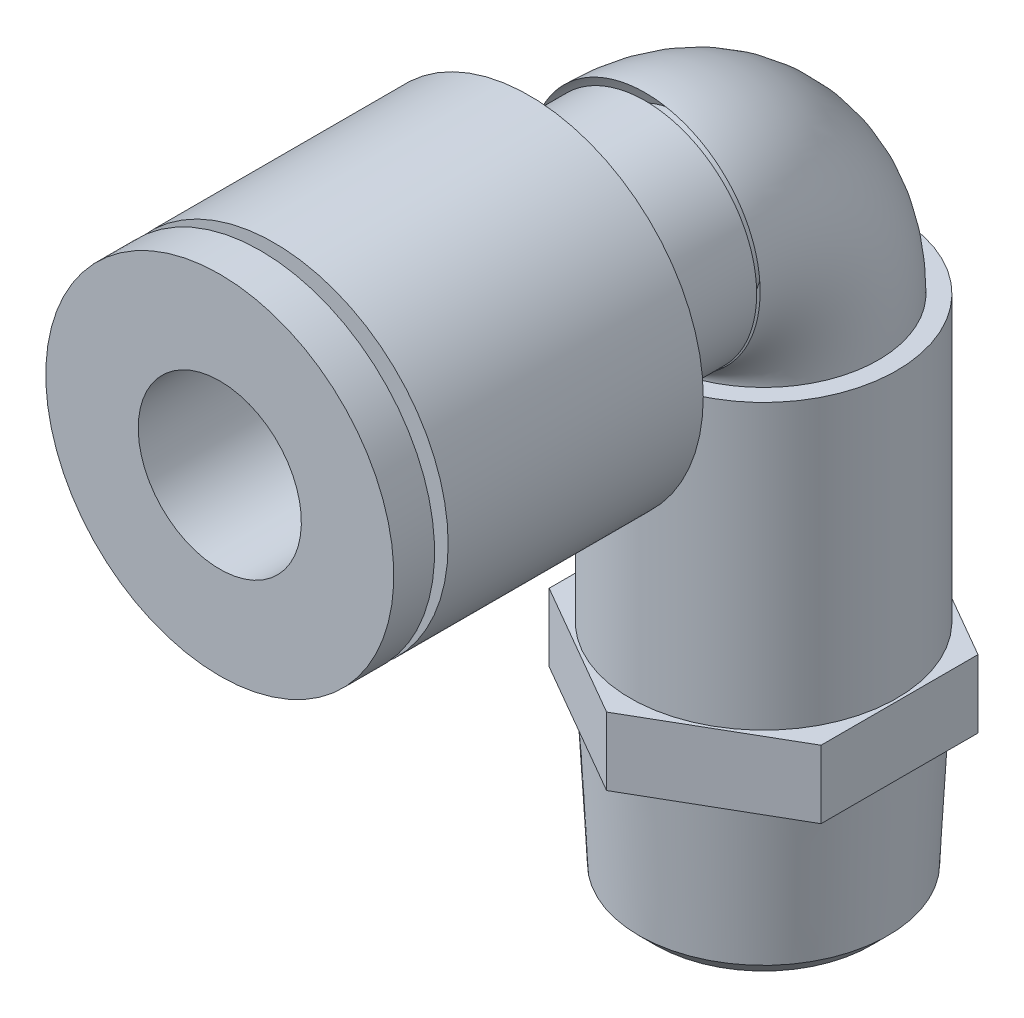
ISO-10303-21;
HEADER;
FILE_DESCRIPTION(('STEP AP214'),'2;1');
FILE_NAME('part.step','',(''),(''),'','','');
FILE_SCHEMA(('AUTOMOTIVE_DESIGN { 1 0 10303 214 1 1 1 1 }'));
ENDSEC;
DATA;
#1=APPLICATION_CONTEXT('core data for automotive mechanical design processes');
#2=APPLICATION_PROTOCOL_DEFINITION('international standard','automotive_design',2000,#1);
#3=PRODUCT_CONTEXT('',#1,'mechanical');
#4=PRODUCT('Part','Part','',(#3));
#5=PRODUCT_RELATED_PRODUCT_CATEGORY('part','',(#4));
#6=PRODUCT_DEFINITION_FORMATION('','',#4);
#7=PRODUCT_DEFINITION_CONTEXT('part definition',#1,'design');
#8=PRODUCT_DEFINITION('design','',#6,#7);
#9=PRODUCT_DEFINITION_SHAPE('','',#8);
#10=(LENGTH_UNIT() NAMED_UNIT(*) SI_UNIT(.MILLI.,.METRE.));
#11=(NAMED_UNIT(*) PLANE_ANGLE_UNIT() SI_UNIT($,.RADIAN.));
#12=(NAMED_UNIT(*) SI_UNIT($,.STERADIAN.) SOLID_ANGLE_UNIT());
#13=UNCERTAINTY_MEASURE_WITH_UNIT(LENGTH_MEASURE(1.E-05),#10,'distance_accuracy_value','');
#14=(GEOMETRIC_REPRESENTATION_CONTEXT(3) GLOBAL_UNCERTAINTY_ASSIGNED_CONTEXT((#13)) GLOBAL_UNIT_ASSIGNED_CONTEXT((#10,
#11,#12)) REPRESENTATION_CONTEXT('',''));
#15=CARTESIAN_POINT('',(0.,0.,0.));
#16=DIRECTION('',(0.,0.,1.));
#17=DIRECTION('',(1.,0.,0.));
#18=AXIS2_PLACEMENT_3D('',#15,#16,#17);
#19=CARTESIAN_POINT('',(-3.,19.9639957961841,3.));
#20=DIRECTION('',(0.,0.,1.));
#21=DIRECTION('',(1.,0.,0.));
#22=AXIS2_PLACEMENT_3D('',#19,#20,#21);
#23=PLANE('',#22);
#24=CARTESIAN_POINT('',(0.,23.,3.));
#25=DIRECTION('',(0.,0.,-1.));
#26=DIRECTION('',(0.,1.,0.));
#27=AXIS2_PLACEMENT_3D('',#24,#25,#26);
#28=CIRCLE('',#27,3.);
#29=CARTESIAN_POINT('',(0.,26.,3.));
#30=VERTEX_POINT('',#29);
#31=EDGE_CURVE('E19',#30,#30,#28,.T.);
#32=ORIENTED_EDGE('',*,*,#31,.F.);
#33=EDGE_LOOP('',(#32));
#34=FACE_BOUND('',#33,.T.);
#35=ADVANCED_FACE('F16',(#34),#23,.T.);
#36=CARTESIAN_POINT('',(0.,23.,20.));
#37=DIRECTION('',(0.,0.,-1.));
#38=DIRECTION('',(0.,1.,0.));
#39=AXIS2_PLACEMENT_3D('',#36,#37,#38);
#40=CYLINDRICAL_SURFACE('',#39,3.);
#41=ORIENTED_EDGE('',*,*,#31,.T.);
#42=EDGE_LOOP('',(#41));
#43=FACE_BOUND('',#42,.T.);
#44=CARTESIAN_POINT('',(0.,23.,20.));
#45=DIRECTION('',(0.,0.,-1.));
#46=DIRECTION('',(0.,1.,0.));
#47=AXIS2_PLACEMENT_3D('',#44,#45,#46);
#48=CIRCLE('',#47,3.);
#49=CARTESIAN_POINT('',(0.,26.,20.));
#50=VERTEX_POINT('',#49);
#51=EDGE_CURVE('E285',#50,#50,#48,.T.);
#52=ORIENTED_EDGE('',*,*,#51,.F.);
#53=EDGE_LOOP('',(#52));
#54=FACE_BOUND('',#53,.T.);
#55=ADVANCED_FACE('F272',(#43,#54),#40,.F.);
#56=CARTESIAN_POINT('',(6.4,29.4768021082254,20.));
#57=DIRECTION('',(0.,0.,1.));
#58=DIRECTION('',(-1.,0.,0.));
#59=AXIS2_PLACEMENT_3D('',#56,#57,#58);
#60=PLANE('',#59);
#61=ORIENTED_EDGE('',*,*,#51,.T.);
#62=EDGE_LOOP('',(#61));
#63=FACE_BOUND('',#62,.T.);
#64=CARTESIAN_POINT('',(0.,23.,20.));
#65=DIRECTION('',(0.,0.,1.));
#66=DIRECTION('',(0.,-1.,0.));
#67=AXIS2_PLACEMENT_3D('',#64,#65,#66);
#68=CIRCLE('',#67,6.4);
#69=CARTESIAN_POINT('',(0.,16.6,20.));
#70=VERTEX_POINT('',#69);
#71=EDGE_CURVE('E286',#70,#70,#68,.F.);
#72=ORIENTED_EDGE('',*,*,#71,.F.);
#73=EDGE_LOOP('',(#72));
#74=FACE_BOUND('',#73,.T.);
#75=ADVANCED_FACE('F269',(#63,#74),#60,.T.);
#76=CARTESIAN_POINT('',(0.,23.,20.));
#77=DIRECTION('',(0.,0.,1.));
#78=DIRECTION('',(0.,-1.,0.));
#79=AXIS2_PLACEMENT_3D('',#76,#77,#78);
#80=CYLINDRICAL_SURFACE('',#79,6.4);
#81=ORIENTED_EDGE('',*,*,#71,.T.);
#82=EDGE_LOOP('',(#81));
#83=FACE_BOUND('',#82,.T.);
#84=CARTESIAN_POINT('',(0.,23.,18.5));
#85=DIRECTION('',(0.,0.,1.));
#86=DIRECTION('',(0.,-1.,0.));
#87=AXIS2_PLACEMENT_3D('',#84,#85,#86);
#88=CIRCLE('',#87,6.4);
#89=CARTESIAN_POINT('',(0.,16.6,18.5));
#90=VERTEX_POINT('',#89);
#91=EDGE_CURVE('E288',#90,#90,#88,.F.);
#92=ORIENTED_EDGE('',*,*,#91,.F.);
#93=EDGE_LOOP('',(#92));
#94=FACE_BOUND('',#93,.T.);
#95=ADVANCED_FACE('F265',(#83,#94),#80,.T.);
#96=CARTESIAN_POINT('',(3.96101064172926,0.,4.00854487762027));
#97=DIRECTION('',(0.,-1.,0.));
#98=DIRECTION('',(-1.,0.,0.));
#99=AXIS2_PLACEMENT_3D('',#96,#97,#98);
#100=PLANE('',#99);
#101=CARTESIAN_POINT('',(0.,0.,0.));
#102=DIRECTION('',(0.,1.,0.));
#103=DIRECTION('',(0.,0.,1.));
#104=AXIS2_PLACEMENT_3D('',#101,#102,#103);
#105=CIRCLE('',#104,3.96101064172926);
#106=CARTESIAN_POINT('',(0.,0.,3.96101064172926));
#107=VERTEX_POINT('',#106);
#108=EDGE_CURVE('E293',#107,#107,#105,.T.);
#109=ORIENTED_EDGE('',*,*,#108,.F.);
#110=EDGE_LOOP('',(#109));
#111=FACE_BOUND('',#110,.T.);
#112=ADVANCED_FACE('F261',(#111),#100,.T.);
#113=CARTESIAN_POINT('',(-6.40000000000001,29.4768021082673,18.5));
#114=DIRECTION('',(0.,0.,-1.));
#115=DIRECTION('',(1.,0.,0.));
#116=AXIS2_PLACEMENT_3D('',#113,#114,#115);
#117=PLANE('',#116);
#118=CARTESIAN_POINT('',(0.,23.,18.5));
#119=DIRECTION('',(0.,0.,1.));
#120=DIRECTION('',(0.,-1.,0.));
#121=AXIS2_PLACEMENT_3D('',#118,#119,#120);
#122=CIRCLE('',#121,4.5);
#123=CARTESIAN_POINT('',(0.,18.5,18.5));
#124=VERTEX_POINT('',#123);
#125=EDGE_CURVE('E109',#124,#124,#122,.F.);
#126=ORIENTED_EDGE('',*,*,#125,.F.);
#127=EDGE_LOOP('',(#126));
#128=FACE_BOUND('',#127,.T.);
#129=ORIENTED_EDGE('',*,*,#91,.T.);
#130=EDGE_LOOP('',(#129));
#131=FACE_BOUND('',#130,.T.);
#132=ADVANCED_FACE('F257',(#128,#131),#117,.T.);
#133=CARTESIAN_POINT('',(0.,0.,0.));
#134=DIRECTION('',(0.,1.,0.));
#135=DIRECTION('',(0.,0.,1.));
#136=AXIS2_PLACEMENT_3D('',#133,#134,#135);
#137=CONICAL_SURFACE('',#136,3.96101064172926,0.78539816339745);
#138=CARTESIAN_POINT('',(0.,0.62034509794002,0.));
#139=DIRECTION('',(0.,-1.,0.));
#140=DIRECTION('',(-1.,0.,0.));
#141=AXIS2_PLACEMENT_3D('',#138,#139,#140);
#142=CIRCLE('',#141,4.58135573966928);
#143=CARTESIAN_POINT('',(-4.58135573966928,0.62034509794002,0.));
#144=VERTEX_POINT('',#143);
#145=EDGE_CURVE('E106',#144,#144,#142,.F.);
#146=ORIENTED_EDGE('',*,*,#145,.F.);
#147=EDGE_LOOP('',(#146));
#148=FACE_BOUND('',#147,.T.);
#149=ORIENTED_EDGE('',*,*,#108,.T.);
#150=EDGE_LOOP('',(#149));
#151=FACE_BOUND('',#150,.T.);
#152=ADVANCED_FACE('F253',(#148,#151),#137,.T.);
#153=CARTESIAN_POINT('',(0.,23.,18.5));
#154=DIRECTION('',(0.,0.,1.));
#155=DIRECTION('',(0.,-1.,0.));
#156=AXIS2_PLACEMENT_3D('',#153,#154,#155);
#157=CYLINDRICAL_SURFACE('',#156,4.5);
#158=ORIENTED_EDGE('',*,*,#125,.T.);
#159=EDGE_LOOP('',(#158));
#160=FACE_BOUND('',#159,.T.);
#161=CARTESIAN_POINT('',(0.,23.,18.));
#162=DIRECTION('',(0.,0.,1.));
#163=DIRECTION('',(0.,-1.,0.));
#164=AXIS2_PLACEMENT_3D('',#161,#162,#163);
#165=CIRCLE('',#164,4.5);
#166=CARTESIAN_POINT('',(0.,18.5,18.));
#167=VERTEX_POINT('',#166);
#168=EDGE_CURVE('E108',#167,#167,#165,.F.);
#169=ORIENTED_EDGE('',*,*,#168,.F.);
#170=EDGE_LOOP('',(#169));
#171=FACE_BOUND('',#170,.T.);
#172=ADVANCED_FACE('F249',(#160,#171),#157,.T.);
#173=CARTESIAN_POINT('',(0.,0.62034509794002,0.));
#174=DIRECTION('',(0.,1.,0.));
#175=DIRECTION('',(0.,0.,1.));
#176=AXIS2_PLACEMENT_3D('',#173,#174,#175);
#177=CONICAL_SURFACE('',#176,4.58135573966928,0.0523598775598302);
#178=CARTESIAN_POINT('',(0.,5.838,0.));
#179=DIRECTION('',(0.,1.,0.));
#180=DIRECTION('',(0.,0.,1.));
#181=AXIS2_PLACEMENT_3D('',#178,#179,#180);
#182=CIRCLE('',#181,4.85480144615152);
#183=CARTESIAN_POINT('',(0.,5.838,4.85480144615152));
#184=VERTEX_POINT('',#183);
#185=EDGE_CURVE('E300',#184,#184,#182,.T.);
#186=ORIENTED_EDGE('',*,*,#185,.F.);
#187=EDGE_LOOP('',(#186));
#188=FACE_BOUND('',#187,.T.);
#189=ORIENTED_EDGE('',*,*,#145,.T.);
#190=EDGE_LOOP('',(#189));
#191=FACE_BOUND('',#190,.T.);
#192=ADVANCED_FACE('F245',(#188,#191),#177,.T.);
#193=CARTESIAN_POINT('',(6.39999999999999,29.4768021082255,18.));
#194=DIRECTION('',(0.,0.,1.));
#195=DIRECTION('',(-1.,0.,0.));
#196=AXIS2_PLACEMENT_3D('',#193,#194,#195);
#197=PLANE('',#196);
#198=ORIENTED_EDGE('',*,*,#168,.T.);
#199=EDGE_LOOP('',(#198));
#200=FACE_BOUND('',#199,.T.);
#201=CARTESIAN_POINT('',(0.,23.,18.));
#202=DIRECTION('',(0.,0.,1.));
#203=DIRECTION('',(1.,0.,0.));
#204=AXIS2_PLACEMENT_3D('',#201,#202,#203);
#205=CIRCLE('',#204,6.4);
#206=CARTESIAN_POINT('',(6.4,23.,18.));
#207=VERTEX_POINT('',#206);
#208=EDGE_CURVE('E84',#207,#207,#205,.F.);
#209=ORIENTED_EDGE('',*,*,#208,.F.);
#210=EDGE_LOOP('',(#209));
#211=FACE_BOUND('',#210,.T.);
#212=ADVANCED_FACE('F241',(#200,#211),#197,.T.);
#213=CARTESIAN_POINT('',(-5.,5.838,5.77350269189626));
#214=DIRECTION('',(0.,-1.,0.));
#215=DIRECTION('',(0.,0.,-1.));
#216=AXIS2_PLACEMENT_3D('',#213,#214,#215);
#217=PLANE('',#216);
#218=ORIENTED_EDGE('',*,*,#185,.T.);
#219=EDGE_LOOP('',(#218));
#220=FACE_BOUND('',#219,.T.);
#221=DIRECTION('',(0.866025403784438,0.,-0.5));
#222=VECTOR('',#221,1.);
#223=CARTESIAN_POINT('',(2.5,5.838,4.3301270189222));
#224=LINE('',#223,#222);
#225=CARTESIAN_POINT('',(6.25124987581674E-08,5.838,5.77350265580465));
#226=VERTEX_POINT('',#225);
#227=CARTESIAN_POINT('',(5.,5.838,2.88675134594813));
#228=VERTEX_POINT('',#227);
#229=EDGE_CURVE('E204',#226,#228,#224,.T.);
#230=ORIENTED_EDGE('',*,*,#229,.F.);
#231=DIRECTION('',(0.866025403784438,0.,0.5));
#232=VECTOR('',#231,1.);
#233=CARTESIAN_POINT('',(-2.5,5.838,4.3301270189222));
#234=LINE('',#233,#232);
#235=CARTESIAN_POINT('',(-5.,5.838,2.88675134594813));
#236=VERTEX_POINT('',#235);
#237=EDGE_CURVE('E90',#236,#226,#234,.T.);
#238=ORIENTED_EDGE('',*,*,#237,.F.);
#239=DIRECTION('',(0.,0.,1.));
#240=VECTOR('',#239,1.);
#241=CARTESIAN_POINT('',(-5.,5.838,0.));
#242=LINE('',#241,#240);
#243=CARTESIAN_POINT('',(-5.,5.838,-2.88675134594813));
#244=VERTEX_POINT('',#243);
#245=EDGE_CURVE('E87',#244,#236,#242,.T.);
#246=ORIENTED_EDGE('',*,*,#245,.F.);
#247=DIRECTION('',(-0.866025403784438,0.,0.5));
#248=VECTOR('',#247,1.);
#249=CARTESIAN_POINT('',(-2.5,5.838,-4.3301270189222));
#250=LINE('',#249,#248);
#251=CARTESIAN_POINT('',(-1.25024997787385E-07,5.838,-5.77350261971304));
#252=VERTEX_POINT('',#251);
#253=EDGE_CURVE('E73',#252,#244,#250,.T.);
#254=ORIENTED_EDGE('',*,*,#253,.F.);
#255=DIRECTION('',(-0.866025403784438,0.,-0.5));
#256=VECTOR('',#255,1.);
#257=CARTESIAN_POINT('',(2.5,5.838,-4.3301270189222));
#258=LINE('',#257,#256);
#259=CARTESIAN_POINT('',(5.,5.838,-2.88675134594813));
#260=VERTEX_POINT('',#259);
#261=EDGE_CURVE('E196',#260,#252,#258,.T.);
#262=ORIENTED_EDGE('',*,*,#261,.F.);
#263=DIRECTION('',(0.,0.,-1.));
#264=VECTOR('',#263,1.);
#265=CARTESIAN_POINT('',(5.,5.838,0.));
#266=LINE('',#265,#264);
#267=EDGE_CURVE('E199',#228,#260,#266,.T.);
#268=ORIENTED_EDGE('',*,*,#267,.F.);
#269=EDGE_LOOP('',(#230,#238,#246,#254,#262,#268));
#270=FACE_BOUND('',#269,.T.);
#271=ADVANCED_FACE('F89',(#220,#270),#217,.T.);
#272=CARTESIAN_POINT('',(0.,23.,18.));
#273=DIRECTION('',(0.,0.,1.));
#274=DIRECTION('',(1.,0.,0.));
#275=AXIS2_PLACEMENT_3D('',#272,#273,#274);
#276=CYLINDRICAL_SURFACE('',#275,6.4);
#277=CARTESIAN_POINT('',(0.,23.,8.6173549393613));
#278=DIRECTION('',(0.,0.,-1.));
#279=DIRECTION('',(-1.,0.,0.));
#280=AXIS2_PLACEMENT_3D('',#277,#278,#279);
#281=CIRCLE('',#280,6.39999999999999);
#282=CARTESIAN_POINT('',(-6.39999999999999,23.,8.6173549393613));
#283=VERTEX_POINT('',#282);
#284=EDGE_CURVE('E102',#283,#283,#281,.T.);
#285=ORIENTED_EDGE('',*,*,#284,.F.);
#286=EDGE_LOOP('',(#285));
#287=FACE_BOUND('',#286,.T.);
#288=ORIENTED_EDGE('',*,*,#208,.T.);
#289=EDGE_LOOP('',(#288));
#290=FACE_BOUND('',#289,.T.);
#291=ADVANCED_FACE('F235',(#287,#290),#276,.T.);
#292=CARTESIAN_POINT('',(0.,5.838,-5.77350269189626));
#293=DIRECTION('',(-0.5,0.,-0.866025403784438));
#294=DIRECTION('',(-0.866025403784438,0.,0.5));
#295=AXIS2_PLACEMENT_3D('',#292,#293,#294);
#296=PLANE('',#295);
#297=ORIENTED_EDGE('',*,*,#253,.T.);
#298=DIRECTION('',(0.,1.,0.));
#299=VECTOR('',#298,1.);
#300=CARTESIAN_POINT('',(-5.,5.838,-2.88675134594813));
#301=LINE('',#300,#299);
#302=CARTESIAN_POINT('',(-5.,8.338,-2.88675134594813));
#303=VERTEX_POINT('',#302);
#304=EDGE_CURVE('E77',#303,#244,#301,.F.);
#305=ORIENTED_EDGE('',*,*,#304,.F.);
#306=CARTESIAN_POINT('',(0.,8.338,-5.77350269189626));
#307=CARTESIAN_POINT('',(-0.208333333333334,8.338,-5.65322138581509));
#308=CARTESIAN_POINT('',(-0.416666666666667,8.338,-5.53294007973392));
#309=CARTESIAN_POINT('',(-0.833333333333333,8.338,-5.29237746757157));
#310=CARTESIAN_POINT('',(-1.04166666666667,8.338,-5.1720961614904));
#311=CARTESIAN_POINT('',(-1.45833333333333,8.338,-4.93153354932806));
#312=CARTESIAN_POINT('',(-1.66666666666667,8.338,-4.81125224324688));
#313=CARTESIAN_POINT('',(-2.08333333333333,8.338,-4.57068963108454));
#314=CARTESIAN_POINT('',(-2.29166666666667,8.338,-4.45040832500337));
#315=CARTESIAN_POINT('',(-2.70833333333333,8.338,-4.20984571284102));
#316=CARTESIAN_POINT('',(-2.91666666666667,8.338,-4.08956440675985));
#317=CARTESIAN_POINT('',(-3.33333333333333,8.338,-3.84900179459751));
#318=CARTESIAN_POINT('',(-3.54166666666667,8.338,-3.72872048851633));
#319=CARTESIAN_POINT('',(-3.95833333333333,8.338,-3.48815787635399));
#320=CARTESIAN_POINT('',(-4.16666666666667,8.338,-3.36787657027282));
#321=CARTESIAN_POINT('',(-4.58333333333333,8.338,-3.12731395811047));
#322=CARTESIAN_POINT('',(-4.79166666666667,8.338,-3.0070326520293));
#323=CARTESIAN_POINT('',(-5.,8.338,-2.88675134594813));
#324=B_SPLINE_CURVE_WITH_KNOTS('',3,(#306,#307,#308,#309,#310,#311,#312,#313,#314,#315,#316,
#317,#318,#319,#320,#321,#322,#323),.UNSPECIFIED.,.F.,.F.,(4,2,2,2,2,2,2,2,4),(0.,
0.721687836487032,1.44337567297406,2.1650635094611,2.88675134594813,3.60843918243516,
4.33012701892219,5.05181485540923,5.77350269189626),.UNSPECIFIED.);
#325=CARTESIAN_POINT('',(-6.25124988123775E-08,8.338,-5.77350265580465));
#326=VERTEX_POINT('',#325);
#327=EDGE_CURVE('E105',#326,#303,#324,.T.);
#328=ORIENTED_EDGE('',*,*,#327,.F.);
#329=DIRECTION('',(0.,1.,0.));
#330=VECTOR('',#329,1.);
#331=CARTESIAN_POINT('',(0.,5.838,-5.77350269189626));
#332=LINE('',#331,#330);
#333=EDGE_CURVE('E80',#252,#326,#332,.T.);
#334=ORIENTED_EDGE('',*,*,#333,.F.);
#335=EDGE_LOOP('',(#297,#305,#328,#334));
#336=FACE_BOUND('',#335,.T.);
#337=ADVANCED_FACE('F75',(#336),#296,.T.);
#338=CARTESIAN_POINT('',(-5.,5.838,-2.88675134594813));
#339=DIRECTION('',(-1.,0.,0.));
#340=DIRECTION('',(0.,0.,1.));
#341=AXIS2_PLACEMENT_3D('',#338,#339,#340);
#342=PLANE('',#341);
#343=ORIENTED_EDGE('',*,*,#245,.T.);
#344=DIRECTION('',(0.,1.,0.));
#345=VECTOR('',#344,1.);
#346=CARTESIAN_POINT('',(-5.,5.838,2.88675134594813));
#347=LINE('',#346,#345);
#348=CARTESIAN_POINT('',(-5.,8.338,2.88675134594813));
#349=VERTEX_POINT('',#348);
#350=EDGE_CURVE('E93',#349,#236,#347,.F.);
#351=ORIENTED_EDGE('',*,*,#350,.F.);
#352=DIRECTION('',(0.,0.,1.));
#353=VECTOR('',#352,1.);
#354=CARTESIAN_POINT('',(-5.,8.338,0.));
#355=LINE('',#354,#353);
#356=EDGE_CURVE('E97',#303,#349,#355,.T.);
#357=ORIENTED_EDGE('',*,*,#356,.F.);
#358=ORIENTED_EDGE('',*,*,#304,.T.);
#359=EDGE_LOOP('',(#343,#351,#357,#358));
#360=FACE_BOUND('',#359,.T.);
#361=ADVANCED_FACE('F95',(#360),#342,.T.);
#362=CARTESIAN_POINT('',(-5.,5.838,2.88675134594813));
#363=DIRECTION('',(-0.5,0.,0.866025403784438));
#364=DIRECTION('',(0.866025403784438,0.,0.5));
#365=AXIS2_PLACEMENT_3D('',#362,#363,#364);
#366=PLANE('',#365);
#367=ORIENTED_EDGE('',*,*,#237,.T.);
#368=DIRECTION('',(0.,1.,0.));
#369=VECTOR('',#368,1.);
#370=CARTESIAN_POINT('',(0.,5.838,5.77350269189626));
#371=LINE('',#370,#369);
#372=CARTESIAN_POINT('',(-6.25124988123775E-08,8.338,5.77350265580465));
#373=VERTEX_POINT('',#372);
#374=EDGE_CURVE('E206',#373,#226,#371,.F.);
#375=ORIENTED_EDGE('',*,*,#374,.F.);
#376=CARTESIAN_POINT('',(-5.,8.338,2.88675134594813));
#377=CARTESIAN_POINT('',(-4.79166666666667,8.338,3.0070326520293));
#378=CARTESIAN_POINT('',(-4.58333333333333,8.338,3.12731395811047));
#379=CARTESIAN_POINT('',(-4.16666666666667,8.338,3.36787657027282));
#380=CARTESIAN_POINT('',(-3.95833333333333,8.338,3.48815787635399));
#381=CARTESIAN_POINT('',(-3.54166666666667,8.338,3.72872048851633));
#382=CARTESIAN_POINT('',(-3.33333333333333,8.338,3.84900179459751));
#383=CARTESIAN_POINT('',(-2.91666666666667,8.338,4.08956440675985));
#384=CARTESIAN_POINT('',(-2.70833333333333,8.338,4.20984571284102));
#385=CARTESIAN_POINT('',(-2.29166666666667,8.338,4.45040832500337));
#386=CARTESIAN_POINT('',(-2.08333333333333,8.338,4.57068963108454));
#387=CARTESIAN_POINT('',(-1.66666666666667,8.338,4.81125224324688));
#388=CARTESIAN_POINT('',(-1.45833333333333,8.338,4.93153354932806));
#389=CARTESIAN_POINT('',(-1.04166666666667,8.338,5.1720961614904));
#390=CARTESIAN_POINT('',(-0.833333333333333,8.338,5.29237746757157));
#391=CARTESIAN_POINT('',(-0.416666666666667,8.338,5.53294007973392));
#392=CARTESIAN_POINT('',(-0.208333333333333,8.338,5.65322138581509));
#393=CARTESIAN_POINT('',(0.,8.338,5.77350269189626));
#394=B_SPLINE_CURVE_WITH_KNOTS('',3,(#376,#377,#378,#379,#380,#381,#382,#383,#384,#385,#386,
#387,#388,#389,#390,#391,#392,#393),.UNSPECIFIED.,.F.,.F.,(4,2,2,2,2,2,2,2,4),(0.,
0.721687836487032,1.44337567297406,2.1650635094611,2.88675134594813,3.60843918243516,
4.33012701892219,5.05181485540923,5.77350269189626),.UNSPECIFIED.);
#395=EDGE_CURVE('E157',#349,#373,#394,.T.);
#396=ORIENTED_EDGE('',*,*,#395,.F.);
#397=ORIENTED_EDGE('',*,*,#350,.T.);
#398=EDGE_LOOP('',(#367,#375,#396,#397));
#399=FACE_BOUND('',#398,.T.);
#400=ADVANCED_FACE('F211',(#399),#366,.T.);
#401=CARTESIAN_POINT('',(0.,5.838,5.77350269189626));
#402=DIRECTION('',(0.5,0.,0.866025403784438));
#403=DIRECTION('',(0.866025403784438,0.,-0.5));
#404=AXIS2_PLACEMENT_3D('',#401,#402,#403);
#405=PLANE('',#404);
#406=ORIENTED_EDGE('',*,*,#229,.T.);
#407=DIRECTION('',(0.,1.,0.));
#408=VECTOR('',#407,1.);
#409=CARTESIAN_POINT('',(5.,5.838,2.88675134594813));
#410=LINE('',#409,#408);
#411=CARTESIAN_POINT('',(5.,8.338,2.88675134594813));
#412=VERTEX_POINT('',#411);
#413=EDGE_CURVE('E201',#412,#228,#410,.F.);
#414=ORIENTED_EDGE('',*,*,#413,.F.);
#415=CARTESIAN_POINT('',(0.,8.338,5.77350269189626));
#416=CARTESIAN_POINT('',(0.208333333333334,8.338,5.65322138581509));
#417=CARTESIAN_POINT('',(0.416666666666667,8.338,5.53294007973392));
#418=CARTESIAN_POINT('',(0.833333333333334,8.338,5.29237746757157));
#419=CARTESIAN_POINT('',(1.04166666666667,8.338,5.1720961614904));
#420=CARTESIAN_POINT('',(1.45833333333333,8.338,4.93153354932805));
#421=CARTESIAN_POINT('',(1.66666666666667,8.338,4.81125224324688));
#422=CARTESIAN_POINT('',(2.08333333333333,8.338,4.57068963108454));
#423=CARTESIAN_POINT('',(2.29166666666667,8.338,4.45040832500337));
#424=CARTESIAN_POINT('',(2.70833333333333,8.338,4.20984571284102));
#425=CARTESIAN_POINT('',(2.91666666666667,8.338,4.08956440675985));
#426=CARTESIAN_POINT('',(3.33333333333333,8.338,3.84900179459751));
#427=CARTESIAN_POINT('',(3.54166666666667,8.338,3.72872048851633));
#428=CARTESIAN_POINT('',(3.95833333333333,8.338,3.48815787635399));
#429=CARTESIAN_POINT('',(4.16666666666667,8.338,3.36787657027282));
#430=CARTESIAN_POINT('',(4.58333333333333,8.338,3.12731395811047));
#431=CARTESIAN_POINT('',(4.79166666666667,8.338,3.0070326520293));
#432=CARTESIAN_POINT('',(5.,8.338,2.88675134594813));
#433=B_SPLINE_CURVE_WITH_KNOTS('',3,(#415,#416,#417,#418,#419,#420,#421,#422,#423,#424,#425,
#426,#427,#428,#429,#430,#431,#432),.UNSPECIFIED.,.F.,.F.,(4,2,2,2,2,2,2,2,4),(0.,
0.721687836487032,1.44337567297406,2.1650635094611,2.88675134594813,3.60843918243516,
4.33012701892219,5.05181485540923,5.77350269189626),.UNSPECIFIED.);
#434=EDGE_CURVE('E164',#373,#412,#433,.T.);
#435=ORIENTED_EDGE('',*,*,#434,.F.);
#436=ORIENTED_EDGE('',*,*,#374,.T.);
#437=EDGE_LOOP('',(#406,#414,#435,#436));
#438=FACE_BOUND('',#437,.T.);
#439=ADVANCED_FACE('F219',(#438),#405,.T.);
#440=CARTESIAN_POINT('',(5.,5.838,2.88675134594813));
#441=DIRECTION('',(1.,0.,0.));
#442=DIRECTION('',(0.,0.,-1.));
#443=AXIS2_PLACEMENT_3D('',#440,#441,#442);
#444=PLANE('',#443);
#445=ORIENTED_EDGE('',*,*,#267,.T.);
#446=DIRECTION('',(0.,1.,0.));
#447=VECTOR('',#446,1.);
#448=CARTESIAN_POINT('',(5.,5.838,-2.88675134594813));
#449=LINE('',#448,#447);
#450=CARTESIAN_POINT('',(5.,8.338,-2.88675134594813));
#451=VERTEX_POINT('',#450);
#452=EDGE_CURVE('E39',#451,#260,#449,.F.);
#453=ORIENTED_EDGE('',*,*,#452,.F.);
#454=DIRECTION('',(0.,0.,-1.));
#455=VECTOR('',#454,1.);
#456=CARTESIAN_POINT('',(5.,8.338,0.));
#457=LINE('',#456,#455);
#458=EDGE_CURVE('E173',#412,#451,#457,.T.);
#459=ORIENTED_EDGE('',*,*,#458,.F.);
#460=ORIENTED_EDGE('',*,*,#413,.T.);
#461=EDGE_LOOP('',(#445,#453,#459,#460));
#462=FACE_BOUND('',#461,.T.);
#463=ADVANCED_FACE('F217',(#462),#444,.T.);
#464=CARTESIAN_POINT('',(5.,5.838,-2.88675134594813));
#465=DIRECTION('',(0.5,0.,-0.866025403784438));
#466=DIRECTION('',(-0.866025403784438,0.,-0.5));
#467=AXIS2_PLACEMENT_3D('',#464,#465,#466);
#468=PLANE('',#467);
#469=ORIENTED_EDGE('',*,*,#261,.T.);
#470=ORIENTED_EDGE('',*,*,#333,.T.);
#471=CARTESIAN_POINT('',(5.,8.338,-2.88675134594813));
#472=CARTESIAN_POINT('',(4.79166666666667,8.338,-3.0070326520293));
#473=CARTESIAN_POINT('',(4.58333333333333,8.338,-3.12731395811047));
#474=CARTESIAN_POINT('',(4.16666666666667,8.338,-3.36787657027282));
#475=CARTESIAN_POINT('',(3.95833333333333,8.338,-3.48815787635399));
#476=CARTESIAN_POINT('',(3.54166666666667,8.338,-3.72872048851633));
#477=CARTESIAN_POINT('',(3.33333333333333,8.338,-3.84900179459751));
#478=CARTESIAN_POINT('',(2.91666666666667,8.338,-4.08956440675985));
#479=CARTESIAN_POINT('',(2.70833333333333,8.338,-4.20984571284102));
#480=CARTESIAN_POINT('',(2.29166666666667,8.338,-4.45040832500337));
#481=CARTESIAN_POINT('',(2.08333333333333,8.338,-4.57068963108454));
#482=CARTESIAN_POINT('',(1.66666666666667,8.338,-4.81125224324688));
#483=CARTESIAN_POINT('',(1.45833333333333,8.338,-4.93153354932805));
#484=CARTESIAN_POINT('',(1.04166666666667,8.338,-5.1720961614904));
#485=CARTESIAN_POINT('',(0.833333333333334,8.338,-5.29237746757157));
#486=CARTESIAN_POINT('',(0.416666666666667,8.338,-5.53294007973392));
#487=CARTESIAN_POINT('',(0.208333333333334,8.338,-5.65322138581509));
#488=CARTESIAN_POINT('',(0.,8.338,-5.77350269189626));
#489=B_SPLINE_CURVE_WITH_KNOTS('',3,(#471,#472,#473,#474,#475,#476,#477,#478,#479,#480,#481,
#482,#483,#484,#485,#486,#487,#488),.UNSPECIFIED.,.F.,.F.,(4,2,2,2,2,2,2,2,4),(0.,
0.721687836487032,1.44337567297407,2.1650635094611,2.88675134594813,3.60843918243516,
4.33012701892219,5.05181485540923,5.77350269189626),.UNSPECIFIED.);
#490=EDGE_CURVE('E174',#451,#326,#489,.T.);
#491=ORIENTED_EDGE('',*,*,#490,.F.);
#492=ORIENTED_EDGE('',*,*,#452,.T.);
#493=EDGE_LOOP('',(#469,#470,#491,#492));
#494=FACE_BOUND('',#493,.T.);
#495=ADVANCED_FACE('F215',(#494),#468,.T.);
#496=CARTESIAN_POINT('',(0.,23.,8.));
#497=DIRECTION('',(0.,0.,1.));
#498=DIRECTION('',(1.,0.,0.));
#499=AXIS2_PLACEMENT_3D('',#496,#497,#498);
#500=CONICAL_SURFACE('',#499,4.096,1.30899693899575);
#501=CARTESIAN_POINT('',(0.,23.,8.));
#502=DIRECTION('',(0.,0.,1.));
#503=DIRECTION('',(-1.,0.,0.));
#504=AXIS2_PLACEMENT_3D('',#501,#502,#503);
#505=CIRCLE('',#504,4.096);
#506=CARTESIAN_POINT('',(-4.096,23.,8.));
#507=VERTEX_POINT('',#506);
#508=EDGE_CURVE('E183',#507,#507,#505,.F.);
#509=ORIENTED_EDGE('',*,*,#508,.F.);
#510=EDGE_LOOP('',(#509));
#511=FACE_BOUND('',#510,.T.);
#512=ORIENTED_EDGE('',*,*,#284,.T.);
#513=EDGE_LOOP('',(#512));
#514=FACE_BOUND('',#513,.T.);
#515=ADVANCED_FACE('F357',(#511,#514),#500,.T.);
#516=CARTESIAN_POINT('',(-5.,8.338,-5.77350269189626));
#517=DIRECTION('',(0.,1.,0.));
#518=DIRECTION('',(0.,0.,1.));
#519=AXIS2_PLACEMENT_3D('',#516,#517,#518);
#520=PLANE('',#519);
#521=CARTESIAN_POINT('',(0.,8.338,0.));
#522=DIRECTION('',(0.,-1.,0.));
#523=DIRECTION('',(0.,0.,-1.));
#524=AXIS2_PLACEMENT_3D('',#521,#522,#523);
#525=CIRCLE('',#524,4.9);
#526=CARTESIAN_POINT('',(0.,8.338,-4.9));
#527=VERTEX_POINT('',#526);
#528=EDGE_CURVE('E194',#527,#527,#525,.F.);
#529=ORIENTED_EDGE('',*,*,#528,.F.);
#530=EDGE_LOOP('',(#529));
#531=FACE_BOUND('',#530,.T.);
#532=ORIENTED_EDGE('',*,*,#458,.T.);
#533=ORIENTED_EDGE('',*,*,#490,.T.);
#534=ORIENTED_EDGE('',*,*,#327,.T.);
#535=ORIENTED_EDGE('',*,*,#356,.T.);
#536=ORIENTED_EDGE('',*,*,#395,.T.);
#537=ORIENTED_EDGE('',*,*,#434,.T.);
#538=EDGE_LOOP('',(#532,#533,#534,#535,#536,#537));
#539=FACE_BOUND('',#538,.T.);
#540=ADVANCED_FACE('F147',(#531,#539),#520,.T.);
#541=CARTESIAN_POINT('',(0.,23.,8.));
#542=DIRECTION('',(0.,0.,1.));
#543=DIRECTION('',(1.,0.,0.));
#544=AXIS2_PLACEMENT_3D('',#541,#542,#543);
#545=CYLINDRICAL_SURFACE('',#544,4.096);
#546=CARTESIAN_POINT('',(0.,23.,4.352));
#547=DIRECTION('',(0.,0.,1.));
#548=DIRECTION('',(1.,0.,0.));
#549=AXIS2_PLACEMENT_3D('',#546,#547,#548);
#550=CIRCLE('',#549,4.096);
#551=CARTESIAN_POINT('',(0.,18.904,4.35200000000046));
#552=VERTEX_POINT('',#551);
#553=EDGE_CURVE('E30',#552,#552,#550,.F.);
#554=ORIENTED_EDGE('',*,*,#553,.F.);
#555=EDGE_LOOP('',(#554));
#556=FACE_BOUND('',#555,.T.);
#557=ORIENTED_EDGE('',*,*,#508,.T.);
#558=EDGE_LOOP('',(#557));
#559=FACE_BOUND('',#558,.T.);
#560=ADVANCED_FACE('F144',(#556,#559),#545,.T.);
#561=CARTESIAN_POINT('',(0.,8.338,0.));
#562=DIRECTION('',(0.,-1.,0.));
#563=DIRECTION('',(0.,0.,-1.));
#564=AXIS2_PLACEMENT_3D('',#561,#562,#563);
#565=CYLINDRICAL_SURFACE('',#564,4.9);
#566=ORIENTED_EDGE('',*,*,#528,.T.);
#567=EDGE_LOOP('',(#566));
#568=FACE_BOUND('',#567,.T.);
#569=CARTESIAN_POINT('',(0.,18.776,0.));
#570=DIRECTION('',(0.,-1.,0.));
#571=DIRECTION('',(0.,0.,-1.));
#572=AXIS2_PLACEMENT_3D('',#569,#570,#571);
#573=CIRCLE('',#572,4.9);
#574=CARTESIAN_POINT('',(0.,18.776,-4.9));
#575=VERTEX_POINT('',#574);
#576=EDGE_CURVE('E307',#575,#575,#573,.F.);
#577=ORIENTED_EDGE('',*,*,#576,.F.);
#578=EDGE_LOOP('',(#577));
#579=FACE_BOUND('',#578,.T.);
#580=ADVANCED_FACE('F140',(#568,#579),#565,.T.);
#581=CARTESIAN_POINT('',(-4.3093248,18.904,4.352));
#582=CARTESIAN_POINT('',(-4.224,18.904,4.352));
#583=CARTESIAN_POINT('',(4.224,18.904,4.352));
#584=CARTESIAN_POINT('',(4.30848,18.904,4.352));
#585=B_SPLINE_CURVE_WITH_KNOTS('',1,(#581,#582,#583,#584),.UNSPECIFIED.,.F.,.F.,(2,1,1,2),
(-0.0101,0.,1.,1.01),.UNSPECIFIED.);
#586=DIRECTION('',(0.,1.,0.));
#587=VECTOR('',#586,1.);
#588=SURFACE_OF_LINEAR_EXTRUSION('',#585,#587);
#589=CARTESIAN_POINT('',(0.,23.128,4.352));
#590=DIRECTION('',(0.,0.,-1.));
#591=DIRECTION('',(0.,-1.,0.));
#592=AXIS2_PLACEMENT_3D('',#589,#590,#591);
#593=CIRCLE('',#592,4.224);
#594=EDGE_CURVE('E24',#552,#552,#593,.T.);
#595=ORIENTED_EDGE('',*,*,#594,.F.);
#596=ORIENTED_EDGE('',*,*,#553,.T.);
#597=EDGE_LOOP('',(#595,#596));
#598=FACE_BOUND('',#597,.T.);
#599=ADVANCED_FACE('F137',(#598),#588,.T.);
#600=CARTESIAN_POINT('',(-4.9,18.776,4.958802108228));
#601=DIRECTION('',(0.,1.,0.));
#602=DIRECTION('',(1.,0.,0.));
#603=AXIS2_PLACEMENT_3D('',#600,#601,#602);
#604=PLANE('',#603);
#605=CARTESIAN_POINT('',(-4.224,18.776,4.77048955893622E-13));
#606=CARTESIAN_POINT('',(-4.2239928636461,18.776,0.237276423779749));
#607=CARTESIAN_POINT('',(-4.20395583599517,18.776,0.474692174613894));
#608=CARTESIAN_POINT('',(-4.12422573034058,18.776,0.9430863021164));
#609=CARTESIAN_POINT('',(-4.06448878447174,18.776,1.17405726287093));
#610=CARTESIAN_POINT('',(-3.94656243069798,18.776,1.5102946693331));
#611=CARTESIAN_POINT('',(-3.90251483397885,18.776,1.62070436955848));
#612=CARTESIAN_POINT('',(-3.80528258775336,18.776,1.83741114634493));
#613=CARTESIAN_POINT('',(-3.75210119566401,18.776,1.94370967258642));
#614=CARTESIAN_POINT('',(-3.63696856011215,18.776,2.15145236889304));
#615=CARTESIAN_POINT('',(-3.57501634709811,18.776,2.25289600062324));
#616=CARTESIAN_POINT('',(-3.44280996994575,18.776,2.45016872224022));
#617=CARTESIAN_POINT('',(-3.37255890503587,18.776,2.54599988824399));
#618=CARTESIAN_POINT('',(-3.22420596085736,18.776,2.73144241906485));
#619=CARTESIAN_POINT('',(-3.14610092336809,18.776,2.82105125709111));
#620=CARTESIAN_POINT('',(-2.98264912209123,18.776,2.99333838261584));
#621=CARTESIAN_POINT('',(-2.89730503480433,18.776,3.07601920933216));
#622=CARTESIAN_POINT('',(-2.71990743074984,18.776,3.2339433992094));
#623=CARTESIAN_POINT('',(-2.62785021326503,18.776,3.30918260538588));
#624=CARTESIAN_POINT('',(-2.43775828892513,18.776,3.45160984109661));
#625=CARTESIAN_POINT('',(-2.33972579949209,18.776,3.51880083020419));
#626=CARTESIAN_POINT('',(-2.138299357357,18.776,3.6447174881857));
#627=CARTESIAN_POINT('',(-2.03490277460781,18.776,3.70343895003049));
#628=CARTESIAN_POINT('',(-1.82354095116947,18.776,3.81195299018631));
#629=CARTESIAN_POINT('',(-1.71557621867665,18.776,3.86174655849417));
#630=CARTESIAN_POINT('',(-1.49592760051737,18.776,3.9520199617044));
#631=CARTESIAN_POINT('',(-1.38424700868429,18.776,3.99250780624135));
#632=CARTESIAN_POINT('',(-1.15783130515346,18.776,4.06395182887015));
#633=CARTESIAN_POINT('',(-1.04309485284426,18.776,4.09490374613164));
#634=CARTESIAN_POINT('',(-0.775204145472181,18.776,4.15517895158888));
#635=CARTESIAN_POINT('',(-0.621244329780364,18.776,4.18097362500061));
#636=CARTESIAN_POINT('',(-0.311498177615709,18.776,4.21537650113539));
#637=CARTESIAN_POINT('',(-0.155713128609144,18.776,4.22399616151449));
#638=CARTESIAN_POINT('',(0.0853918783286976,18.776,4.22400210499583));
#639=CARTESIAN_POINT('',(0.170762127741568,18.776,4.22141313856831));
#640=CARTESIAN_POINT('',(0.427856427095351,18.776,4.20579571471801));
#641=CARTESIAN_POINT('',(0.599174733862855,18.776,4.18483218531827));
#642=CARTESIAN_POINT('',(0.938233600481896,18.776,4.12209743785902));
#643=CARTESIAN_POINT('',(1.10596747744301,18.776,4.08029038146554));
#644=CARTESIAN_POINT('',(1.38371652984516,18.776,3.99269352237182));
#645=CARTESIAN_POINT('',(1.49542624982919,18.776,3.9522069037501));
#646=CARTESIAN_POINT('',(1.71503803790701,18.776,3.86198678901564));
#647=CARTESIAN_POINT('',(1.82293935577793,18.776,3.81225148295302));
#648=CARTESIAN_POINT('',(2.13986324999926,18.776,3.64957235044911));
#649=CARTESIAN_POINT('',(2.34222982855113,18.776,3.52311609990248));
#650=CARTESIAN_POINT('',(2.62740134313659,18.776,3.30955330424942));
#651=CARTESIAN_POINT('',(2.71943242751455,18.776,3.23434705943671));
#652=CARTESIAN_POINT('',(2.8968386392021,18.776,3.07645347057777));
#653=CARTESIAN_POINT('',(2.9822161307479,18.776,2.99376880662746));
#654=CARTESIAN_POINT('',(3.1457142879504,18.776,2.82148465220234));
#655=CARTESIAN_POINT('',(3.22383300272557,18.776,2.731883314568));
#656=CARTESIAN_POINT('',(3.37221864083487,18.776,2.54645039220412));
#657=CARTESIAN_POINT('',(3.44248847356807,18.776,2.45062113699507));
#658=CARTESIAN_POINT('',(3.57473390130941,18.776,2.25334465207934));
#659=CARTESIAN_POINT('',(3.63670607782748,18.776,2.15189513110587));
#660=CARTESIAN_POINT('',(3.75186117484139,18.776,1.94417346633376));
#661=CARTESIAN_POINT('',(3.80504732469124,18.776,1.83790311284755));
#662=CARTESIAN_POINT('',(3.9022985646634,18.776,1.62121864621057));
#663=CARTESIAN_POINT('',(3.94636013858653,18.776,1.51080295492393));
#664=CARTESIAN_POINT('',(4.02500861536911,18.776,1.28669310233583));
#665=CARTESIAN_POINT('',(4.05959901028839,18.776,1.17300016650226));
#666=CARTESIAN_POINT('',(4.1190915772204,18.776,0.943063224708479));
#667=CARTESIAN_POINT('',(4.14399024373637,18.776,0.826818311728609));
#668=CARTESIAN_POINT('',(4.18389712387483,18.776,0.592687233975424));
#669=CARTESIAN_POINT('',(4.19890898414583,18.776,0.474801690732804));
#670=CARTESIAN_POINT('',(4.21895394230461,18.776,0.238141331810649));
#671=CARTESIAN_POINT('',(4.22398335329953,18.776,0.119366203825338));
#672=CARTESIAN_POINT('',(4.22401655804629,18.776,-0.118141540106692));
#673=CARTESIAN_POINT('',(4.21902405120251,18.776,-0.236874155564945));
#674=CARTESIAN_POINT('',(4.19905264208631,18.776,-0.473540362707441));
#675=CARTESIAN_POINT('',(4.18407008525441,18.776,-0.59147364602562));
#676=CARTESIAN_POINT('',(4.14422885966902,18.776,-0.825615160603728));
#677=CARTESIAN_POINT('',(4.1193738372727,18.776,-0.941824012355225));
#678=CARTESIAN_POINT('',(4.05995304880282,18.776,-1.17177852659013));
#679=CARTESIAN_POINT('',(4.02538364553946,18.776,-1.28552324925774));
#680=CARTESIAN_POINT('',(3.94679848273222,18.776,-1.50965404662248));
#681=CARTESIAN_POINT('',(3.90278620517373,18.776,-1.62004134225953));
#682=CARTESIAN_POINT('',(3.80560382417753,18.776,-1.8367530046006));
#683=CARTESIAN_POINT('',(3.75243068624835,18.776,-1.94307601072314));
#684=CARTESIAN_POINT('',(3.63733031658949,18.776,-2.15083853658854));
#685=CARTESIAN_POINT('',(3.5754051126933,18.776,-2.25227918028543));
#686=CARTESIAN_POINT('',(3.44325223256332,18.776,-2.44954526116656));
#687=CARTESIAN_POINT('',(3.37302819199879,18.776,-2.5453731299558));
#688=CARTESIAN_POINT('',(3.22471378527392,18.776,-2.73084756764557));
#689=CARTESIAN_POINT('',(3.14661590064015,18.776,-2.82048808823102));
#690=CARTESIAN_POINT('',(2.9014854069177,18.776,-3.07892978193474));
#691=CARTESIAN_POINT('',(2.72343906034001,18.776,-3.23751459048967));
#692=CARTESIAN_POINT('',(2.34322431261163,18.776,-3.52248735220616));
#693=CARTESIAN_POINT('',(2.1410566868723,18.776,-3.64887633993697));
#694=CARTESIAN_POINT('',(1.82412466710093,18.776,-3.8116846264875));
#695=CARTESIAN_POINT('',(1.71607107750524,18.776,-3.8615325343849));
#696=CARTESIAN_POINT('',(1.49621006052421,18.776,-3.95191445982532));
#697=CARTESIAN_POINT('',(1.38440583896312,18.776,-3.99245621040156));
#698=CARTESIAN_POINT('',(1.15793894152577,18.776,-4.06391934084369));
#699=CARTESIAN_POINT('',(1.04328031124542,18.776,-4.09485358290807));
#700=CARTESIAN_POINT('',(0.811784065113172,18.776,-4.14695690764065));
#701=CARTESIAN_POINT('',(0.69494693371771,18.776,-4.16812813509147));
#702=CARTESIAN_POINT('',(0.481796965689482,18.776,-4.19754360373057));
#703=CARTESIAN_POINT('',(0.385711236242167,18.776,-4.20746038082082));
#704=CARTESIAN_POINT('',(0.193086002233714,18.776,-4.22068874913247));
#705=CARTESIAN_POINT('',(0.0965464973432527,18.776,-4.22400033555947));
#706=CARTESIAN_POINT('',(-0.11861055917104,18.776,-4.22399958775412));
#707=CARTESIAN_POINT('',(-0.237231672004658,18.776,-4.21900051364069));
#708=CARTESIAN_POINT('',(-0.473678506535708,18.776,-4.19903433557194));
#709=CARTESIAN_POINT('',(-0.591503858399171,18.776,-4.18406288102984));
#710=CARTESIAN_POINT('',(-0.825649605346014,18.776,-4.14422506355969));
#711=CARTESIAN_POINT('',(-0.941967533938837,18.776,-4.11934418962157));
#712=CARTESIAN_POINT('',(-1.17213427284616,18.776,-4.05985366547045));
#713=CARTESIAN_POINT('',(-1.28598214547482,18.776,-4.02524038790418));
#714=CARTESIAN_POINT('',(-1.51023117096961,18.776,-3.94657841998301));
#715=CARTESIAN_POINT('',(-1.62063593505686,18.776,-3.90254002431032));
#716=CARTESIAN_POINT('',(-1.83738301610912,18.776,-3.80530071971833));
#717=CARTESIAN_POINT('',(-1.94372381833604,18.776,-3.75209643436883));
#718=CARTESIAN_POINT('',(-2.15145914488131,18.776,-3.63696172665925));
#719=CARTESIAN_POINT('',(-2.25285759875427,18.776,-3.5750383941609));
#720=CARTESIAN_POINT('',(-2.4501162155207,18.776,-3.44284884519361));
#721=CARTESIAN_POINT('',(-2.54597432564462,18.776,-3.37257956552986));
#722=CARTESIAN_POINT('',(-2.73140287475556,18.776,-3.2242373855738));
#723=CARTESIAN_POINT('',(-2.82097518207293,18.776,-3.14616682092554));
#724=CARTESIAN_POINT('',(-2.99325828426893,18.776,-2.98273138368749));
#725=CARTESIAN_POINT('',(-3.07596651093121,18.776,-2.8973638049321));
#726=CARTESIAN_POINT('',(-3.23389475523479,18.776,-2.7199624988117));
#727=CARTESIAN_POINT('',(-3.30911527669019,18.776,-2.62792922067255));
#728=CARTESIAN_POINT('',(-3.45155030630091,18.776,-2.43784859628238));
#729=CARTESIAN_POINT('',(-3.51876195489188,18.776,-2.33979912076787));
#730=CARTESIAN_POINT('',(-3.70762355399025,18.776,-2.03764748903684));
#731=CARTESIAN_POINT('',(-3.8166057989477,18.776,-1.82542323709326));
#732=CARTESIAN_POINT('',(-3.99721189281562,18.776,-1.38595607576275));
#733=CARTESIAN_POINT('',(-4.06887702554928,18.776,-1.15873007781816));
#734=CARTESIAN_POINT('',(-4.15518651380922,18.776,-0.775196466746068));
#735=CARTESIAN_POINT('',(-4.18095903084905,18.776,-0.62131155877152));
#736=CARTESIAN_POINT('',(-4.21536811197971,18.776,-0.311637802446417));
#737=CARTESIAN_POINT('',(-4.22400468733169,18.776,-0.155848955347135));
#738=CARTESIAN_POINT('',(-4.224,18.776,4.77048955893622E-13));
#739=B_SPLINE_CURVE_WITH_KNOTS('',3,(#605,#606,#607,#608,#609,#610,#611,#612,#613,#614,#615,
#616,#617,#618,#619,#620,#621,#622,#623,#624,#625,#626,#627,#628,#629,#630,#631,#632,#633,#634,
#635,#636,#637,#638,#639,#640,#641,#642,#643,#644,#645,#646,#647,#648,#649,#650,#651,#652,#653,
#654,#655,#656,#657,#658,#659,#660,#661,#662,#663,#664,#665,#666,#667,#668,#669,#670,#671,#672,
#673,#674,#675,#676,#677,#678,#679,#680,#681,#682,#683,#684,#685,#686,#687,#688,#689,#690,#691,
#692,#693,#694,#695,#696,#697,#698,#699,#700,#701,#702,#703,#704,#705,#706,#707,#708,#709,#710,
#711,#712,#713,#714,#715,#716,#717,#718,#719,#720,#721,#722,#723,#724,#725,#726,#727,#728,#729,
#730,#731,#732,#733,#734,#735,#736,#737,#738),.UNSPECIFIED.,.T.,.F.,(4,2,2,2,2,2,2,2,2,2,2,2,2,
2,2,2,2,2,2,2,2,2,2,2,2,2,2,2,2,2,2,2,2,2,2,2,2,2,2,2,2,2,2,2,2,2,2,2,2,2,2,2,2,2,2,2,2,2,2,2,2,
2,2,2,2,2,4),(0.,0.711285307172859,1.42335788457084,1.77962254841759,2.13576041919956,
2.49193768926028,2.84798236199014,3.20417078347504,3.56022808037919,3.91648316520892,
4.27260683941775,4.62890680453545,4.98516723577198,5.34111986804846,5.6972313167121,
6.16457698542087,6.63161077773704,6.88772850605626,7.4041125562267,7.92138755443108,
8.27742933926959,8.63354087424864,9.34537831207614,9.7016152081217,10.0577249390113,
10.4139301034091,10.7700027895128,11.126221722936,11.4823094333354,11.8385341095441,
12.1946272669513,12.5508491037833,12.9069394781,13.2631613454904,13.6192517443898,
13.9754724797775,14.3315617685672,14.6877845598374,15.0438762218285,15.4000860650775,
15.7562135102201,16.1121855124948,16.468500699153,17.1801910782635,17.8918585852787,
18.2484968999075,18.6048377812466,18.9606995286802,19.3164830615302,19.6060516607097,
19.8956204700735,20.2513653115982,20.6072654533924,20.9636886905935,21.3202449463901,
21.6764137196174,22.0327139760437,22.3887261636406,22.7448694237673,23.1009063750335,
23.4570759436019,23.8132215308959,24.1694939011791,24.8815675674171,25.5928517857413,
26.0600416698448,26.5272312469269),.UNSPECIFIED.);
#740=CARTESIAN_POINT('',(-4.224,18.776,4.77048955893622E-13));
#741=VERTEX_POINT('',#740);
#742=EDGE_CURVE('E11',#741,#741,#739,.T.);
#743=ORIENTED_EDGE('',*,*,#742,.F.);
#744=EDGE_LOOP('',(#743));
#745=FACE_BOUND('',#744,.T.);
#746=ORIENTED_EDGE('',*,*,#576,.T.);
#747=EDGE_LOOP('',(#746));
#748=FACE_BOUND('',#747,.T.);
#749=ADVANCED_FACE('F117',(#745,#748),#604,.T.);
#750=CARTESIAN_POINT('',(0.,18.776,4.352));
#751=DIRECTION('',(-1.,0.,0.));
#752=DIRECTION('',(0.,0.,1.));
#753=AXIS2_PLACEMENT_3D('',#750,#751,#752);
#754=TOROIDAL_SURFACE('',#753,4.352,4.224);
#755=ORIENTED_EDGE('',*,*,#594,.T.);
#756=EDGE_LOOP('',(#755));
#757=FACE_BOUND('',#756,.T.);
#758=ORIENTED_EDGE('',*,*,#742,.T.);
#759=EDGE_LOOP('',(#758));
#760=FACE_BOUND('',#759,.T.);
#761=ADVANCED_FACE('F120',(#757,#760),#754,.T.);
#762=CLOSED_SHELL('',(#35,#55,#75,#95,#112,#132,#152,#172,#192,#212,#271,#291,#337,#361,#400,
#439,#463,#495,#515,#540,#560,#580,#599,#749,#761));
#763=MANIFOLD_SOLID_BREP('B1',#762);
#764=ADVANCED_BREP_SHAPE_REPRESENTATION('',(#18,#763),#14);
#765=SHAPE_DEFINITION_REPRESENTATION(#9,#764);
ENDSEC;
END-ISO-10303-21;
